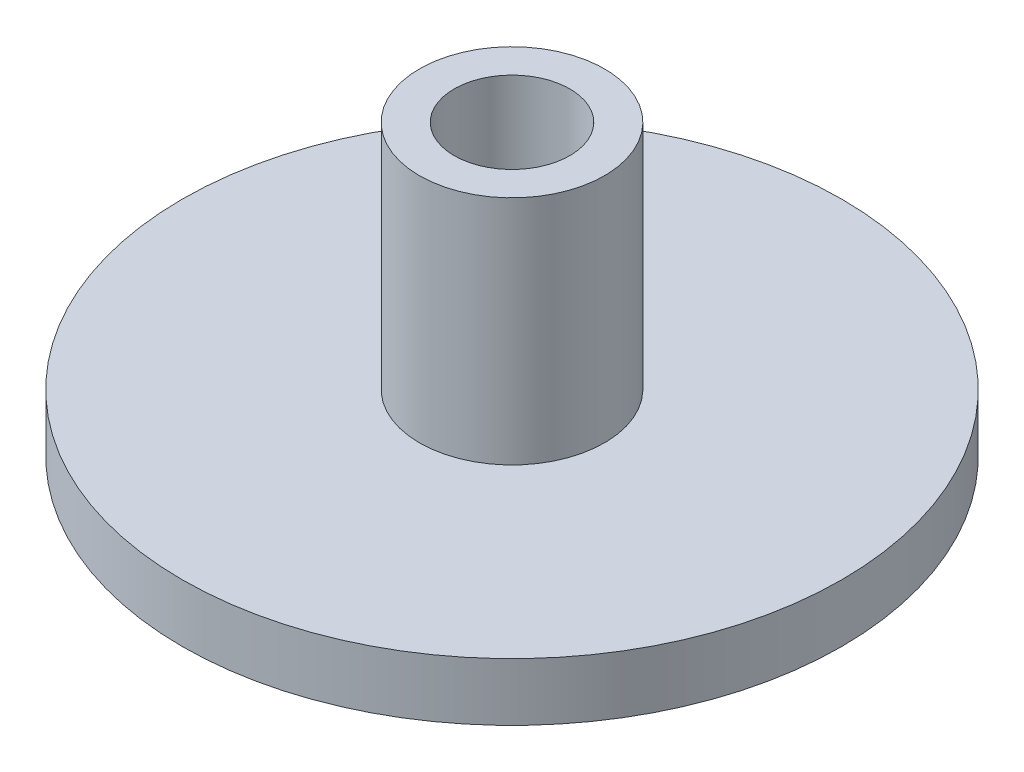
ISO-10303-21;
HEADER;
FILE_DESCRIPTION(('STEP AP214'),'2;1');
FILE_NAME('part.step','',(''),(''),'','','');
FILE_SCHEMA(('AUTOMOTIVE_DESIGN { 1 0 10303 214 1 1 1 1 }'));
ENDSEC;
DATA;
#1=APPLICATION_CONTEXT('core data for automotive mechanical design processes');
#2=APPLICATION_PROTOCOL_DEFINITION('international standard','automotive_design',2000,#1);
#3=PRODUCT_CONTEXT('',#1,'mechanical');
#4=PRODUCT('Part','Part','',(#3));
#5=PRODUCT_RELATED_PRODUCT_CATEGORY('part','',(#4));
#6=PRODUCT_DEFINITION_FORMATION('','',#4);
#7=PRODUCT_DEFINITION_CONTEXT('part definition',#1,'design');
#8=PRODUCT_DEFINITION('design','',#6,#7);
#9=PRODUCT_DEFINITION_SHAPE('','',#8);
#10=(LENGTH_UNIT() NAMED_UNIT(*) SI_UNIT(.MILLI.,.METRE.));
#11=(NAMED_UNIT(*) PLANE_ANGLE_UNIT() SI_UNIT($,.RADIAN.));
#12=(NAMED_UNIT(*) SI_UNIT($,.STERADIAN.) SOLID_ANGLE_UNIT());
#13=UNCERTAINTY_MEASURE_WITH_UNIT(LENGTH_MEASURE(1.E-05),#10,'distance_accuracy_value','');
#14=(GEOMETRIC_REPRESENTATION_CONTEXT(3) GLOBAL_UNCERTAINTY_ASSIGNED_CONTEXT((#13)) GLOBAL_UNIT_ASSIGNED_CONTEXT((#10,
#11,#12)) REPRESENTATION_CONTEXT('',''));
#15=CARTESIAN_POINT('',(0.,0.,0.));
#16=DIRECTION('',(0.,0.,1.));
#17=DIRECTION('',(1.,0.,0.));
#18=AXIS2_PLACEMENT_3D('',#15,#16,#17);
#19=CARTESIAN_POINT('',(0.,5.,0.));
#20=DIRECTION('',(0.,-1.,0.));
#21=DIRECTION('',(0.,0.,-1.));
#22=AXIS2_PLACEMENT_3D('',#19,#20,#21);
#23=CYLINDRICAL_SURFACE('',#22,28.5);
#24=CARTESIAN_POINT('',(0.,5.,0.));
#25=DIRECTION('',(0.,1.,0.));
#26=DIRECTION('',(0.,0.,1.));
#27=AXIS2_PLACEMENT_3D('',#24,#25,#26);
#28=CIRCLE('',#27,28.5);
#29=CARTESIAN_POINT('',(0.,5.,28.5));
#30=VERTEX_POINT('',#29);
#31=EDGE_CURVE('E10',#30,#30,#28,.T.);
#32=ORIENTED_EDGE('',*,*,#31,.F.);
#33=EDGE_LOOP('',(#32));
#34=FACE_BOUND('',#33,.T.);
#35=CARTESIAN_POINT('',(0.,0.,0.));
#36=DIRECTION('',(0.,1.,0.));
#37=DIRECTION('',(0.,0.,1.));
#38=AXIS2_PLACEMENT_3D('',#35,#36,#37);
#39=CIRCLE('',#38,28.5);
#40=CARTESIAN_POINT('',(0.,0.,28.5));
#41=VERTEX_POINT('',#40);
#42=EDGE_CURVE('E33',#41,#41,#39,.T.);
#43=ORIENTED_EDGE('',*,*,#42,.T.);
#44=EDGE_LOOP('',(#43));
#45=FACE_BOUND('',#44,.T.);
#46=ADVANCED_FACE('F30',(#34,#45),#23,.T.);
#47=CARTESIAN_POINT('',(0.,5.,0.));
#48=DIRECTION('',(0.,1.,0.));
#49=DIRECTION('',(0.,0.,1.));
#50=AXIS2_PLACEMENT_3D('',#47,#48,#49);
#51=PLANE('',#50);
#52=CARTESIAN_POINT('',(0.,5.,0.));
#53=DIRECTION('',(0.,1.,0.));
#54=DIRECTION('',(0.,0.,1.));
#55=AXIS2_PLACEMENT_3D('',#52,#53,#54);
#56=CIRCLE('',#55,8.);
#57=CARTESIAN_POINT('',(0.,5.,8.));
#58=VERTEX_POINT('',#57);
#59=EDGE_CURVE('E42',#58,#58,#56,.T.);
#60=ORIENTED_EDGE('',*,*,#59,.F.);
#61=EDGE_LOOP('',(#60));
#62=FACE_BOUND('',#61,.T.);
#63=ORIENTED_EDGE('',*,*,#31,.T.);
#64=EDGE_LOOP('',(#63));
#65=FACE_BOUND('',#64,.T.);
#66=ADVANCED_FACE('F75',(#62,#65),#51,.T.);
#67=CARTESIAN_POINT('',(0.,0.,0.));
#68=DIRECTION('',(0.,1.,0.));
#69=DIRECTION('',(0.,0.,1.));
#70=AXIS2_PLACEMENT_3D('',#67,#68,#69);
#71=PLANE('',#70);
#72=CARTESIAN_POINT('',(0.,0.,0.));
#73=DIRECTION('',(0.,1.,0.));
#74=DIRECTION('',(0.,0.,1.));
#75=AXIS2_PLACEMENT_3D('',#72,#73,#74);
#76=CIRCLE('',#75,5.);
#77=CARTESIAN_POINT('',(0.,0.,5.));
#78=VERTEX_POINT('',#77);
#79=EDGE_CURVE('E45',#78,#78,#76,.T.);
#80=ORIENTED_EDGE('',*,*,#79,.T.);
#81=EDGE_LOOP('',(#80));
#82=FACE_BOUND('',#81,.T.);
#83=ORIENTED_EDGE('',*,*,#42,.F.);
#84=EDGE_LOOP('',(#83));
#85=FACE_BOUND('',#84,.T.);
#86=ADVANCED_FACE('F54',(#82,#85),#71,.F.);
#87=CARTESIAN_POINT('',(0.,25.,0.));
#88=DIRECTION('',(0.,-1.,0.));
#89=DIRECTION('',(0.,0.,-1.));
#90=AXIS2_PLACEMENT_3D('',#87,#88,#89);
#91=CYLINDRICAL_SURFACE('',#90,8.);
#92=CARTESIAN_POINT('',(0.,25.,0.));
#93=DIRECTION('',(0.,1.,0.));
#94=DIRECTION('',(0.,0.,1.));
#95=AXIS2_PLACEMENT_3D('',#92,#93,#94);
#96=CIRCLE('',#95,8.);
#97=CARTESIAN_POINT('',(0.,25.,8.));
#98=VERTEX_POINT('',#97);
#99=EDGE_CURVE('E40',#98,#98,#96,.T.);
#100=ORIENTED_EDGE('',*,*,#99,.F.);
#101=EDGE_LOOP('',(#100));
#102=FACE_BOUND('',#101,.T.);
#103=ORIENTED_EDGE('',*,*,#59,.T.);
#104=EDGE_LOOP('',(#103));
#105=FACE_BOUND('',#104,.T.);
#106=ADVANCED_FACE('F66',(#102,#105),#91,.T.);
#107=CARTESIAN_POINT('',(0.,25.,0.));
#108=DIRECTION('',(0.,1.,0.));
#109=DIRECTION('',(0.,0.,1.));
#110=AXIS2_PLACEMENT_3D('',#107,#108,#109);
#111=PLANE('',#110);
#112=CARTESIAN_POINT('',(0.,25.,0.));
#113=DIRECTION('',(0.,1.,0.));
#114=DIRECTION('',(0.,0.,1.));
#115=AXIS2_PLACEMENT_3D('',#112,#113,#114);
#116=CIRCLE('',#115,5.);
#117=CARTESIAN_POINT('',(0.,25.,5.));
#118=VERTEX_POINT('',#117);
#119=EDGE_CURVE('E48',#118,#118,#116,.T.);
#120=ORIENTED_EDGE('',*,*,#119,.F.);
#121=EDGE_LOOP('',(#120));
#122=FACE_BOUND('',#121,.T.);
#123=ORIENTED_EDGE('',*,*,#99,.T.);
#124=EDGE_LOOP('',(#123));
#125=FACE_BOUND('',#124,.T.);
#126=ADVANCED_FACE('F60',(#122,#125),#111,.T.);
#127=CARTESIAN_POINT('',(0.,0.,0.));
#128=DIRECTION('',(0.,1.,0.));
#129=DIRECTION('',(0.,0.,1.));
#130=AXIS2_PLACEMENT_3D('',#127,#128,#129);
#131=CYLINDRICAL_SURFACE('',#130,5.);
#132=ORIENTED_EDGE('',*,*,#79,.F.);
#133=EDGE_LOOP('',(#132));
#134=FACE_BOUND('',#133,.T.);
#135=ORIENTED_EDGE('',*,*,#119,.T.);
#136=EDGE_LOOP('',(#135));
#137=FACE_BOUND('',#136,.T.);
#138=ADVANCED_FACE('F57',(#134,#137),#131,.F.);
#139=CLOSED_SHELL('',(#46,#66,#86,#106,#126,#138));
#140=MANIFOLD_SOLID_BREP('B2',#139);
#141=ADVANCED_BREP_SHAPE_REPRESENTATION('',(#18,#140),#14);
#142=SHAPE_DEFINITION_REPRESENTATION(#9,#141);
ENDSEC;
END-ISO-10303-21;
